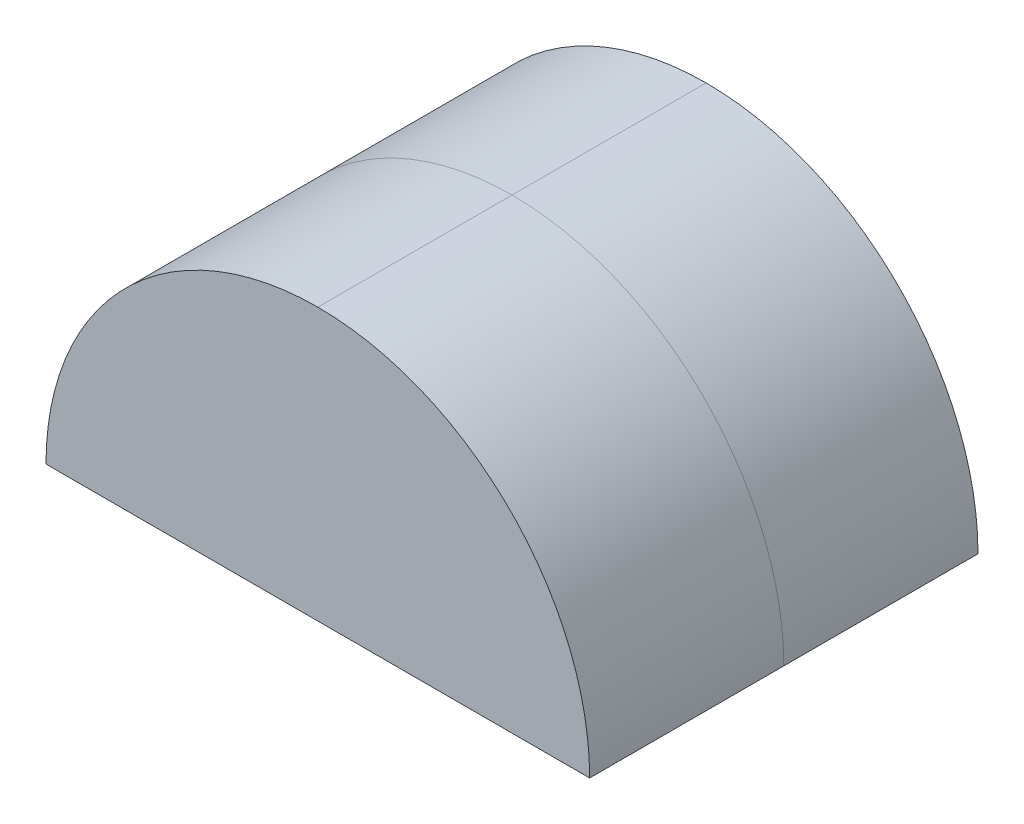
ISO-10303-21;
HEADER;
FILE_DESCRIPTION(('STEP AP214'),'2;1');
FILE_NAME('part.step','',(''),(''),'','','');
FILE_SCHEMA(('AUTOMOTIVE_DESIGN { 1 0 10303 214 1 1 1 1 }'));
ENDSEC;
DATA;
#1=APPLICATION_CONTEXT('core data for automotive mechanical design processes');
#2=APPLICATION_PROTOCOL_DEFINITION('international standard','automotive_design',2000,#1);
#3=PRODUCT_CONTEXT('',#1,'mechanical');
#4=PRODUCT('Part','Part','',(#3));
#5=PRODUCT_RELATED_PRODUCT_CATEGORY('part','',(#4));
#6=PRODUCT_DEFINITION_FORMATION('','',#4);
#7=PRODUCT_DEFINITION_CONTEXT('part definition',#1,'design');
#8=PRODUCT_DEFINITION('design','',#6,#7);
#9=PRODUCT_DEFINITION_SHAPE('','',#8);
#10=(LENGTH_UNIT() NAMED_UNIT(*) SI_UNIT(.MILLI.,.METRE.));
#11=(NAMED_UNIT(*) PLANE_ANGLE_UNIT() SI_UNIT($,.RADIAN.));
#12=(NAMED_UNIT(*) SI_UNIT($,.STERADIAN.) SOLID_ANGLE_UNIT());
#13=UNCERTAINTY_MEASURE_WITH_UNIT(LENGTH_MEASURE(1.E-05),#10,'distance_accuracy_value','');
#14=(GEOMETRIC_REPRESENTATION_CONTEXT(3) GLOBAL_UNCERTAINTY_ASSIGNED_CONTEXT((#13)) GLOBAL_UNIT_ASSIGNED_CONTEXT((#10,
#11,#12)) REPRESENTATION_CONTEXT('',''));
#15=CARTESIAN_POINT('',(0.,0.,0.));
#16=DIRECTION('',(0.,0.,1.));
#17=DIRECTION('',(1.,0.,0.));
#18=AXIS2_PLACEMENT_3D('',#15,#16,#17);
#19=CARTESIAN_POINT('',(0.,0.,25.4));
#20=DIRECTION('',(0.,0.,-1.));
#21=DIRECTION('',(-1.,0.,0.));
#22=AXIS2_PLACEMENT_3D('',#19,#20,#21);
#23=CYLINDRICAL_SURFACE('',#22,17.78);
#24=DIRECTION('',(0.,0.,-1.));
#25=VECTOR('',#24,1.);
#26=CARTESIAN_POINT('',(0.,17.78,25.4));
#27=LINE('',#26,#25);
#28=CARTESIAN_POINT('',(0.,17.78,12.7));
#29=VERTEX_POINT('',#28);
#30=CARTESIAN_POINT('',(0.,17.78,25.4));
#31=VERTEX_POINT('',#30);
#32=EDGE_CURVE('E88',#29,#31,#27,.F.);
#33=ORIENTED_EDGE('',*,*,#32,.F.);
#34=CARTESIAN_POINT('',(0.,0.,12.7));
#35=DIRECTION('',(0.,0.,-1.));
#36=DIRECTION('',(-1.,0.,0.));
#37=AXIS2_PLACEMENT_3D('',#34,#35,#36);
#38=CIRCLE('',#37,17.78);
#39=CARTESIAN_POINT('',(-17.78,0.,12.7));
#40=VERTEX_POINT('',#39);
#41=EDGE_CURVE('E11',#29,#40,#38,.F.);
#42=ORIENTED_EDGE('',*,*,#41,.T.);
#43=DIRECTION('',(0.,0.,-1.));
#44=VECTOR('',#43,1.);
#45=CARTESIAN_POINT('',(-17.78,0.,25.4));
#46=LINE('',#45,#44);
#47=CARTESIAN_POINT('',(-17.78,0.,25.4));
#48=VERTEX_POINT('',#47);
#49=EDGE_CURVE('E114',#48,#40,#46,.T.);
#50=ORIENTED_EDGE('',*,*,#49,.F.);
#51=CARTESIAN_POINT('',(0.,0.,25.4));
#52=DIRECTION('',(0.,0.,-1.));
#53=DIRECTION('',(-1.,0.,0.));
#54=AXIS2_PLACEMENT_3D('',#51,#52,#53);
#55=CIRCLE('',#54,17.78);
#56=EDGE_CURVE('E93',#48,#31,#55,.T.);
#57=ORIENTED_EDGE('',*,*,#56,.T.);
#58=EDGE_LOOP('',(#33,#42,#50,#57));
#59=FACE_BOUND('',#58,.T.);
#60=ADVANCED_FACE('F41',(#59),#23,.T.);
#61=DIRECTION('',(0.,0.,-1.));
#62=VECTOR('',#61,1.);
#63=CARTESIAN_POINT('',(17.78,0.,25.4));
#64=LINE('',#63,#62);
#65=CARTESIAN_POINT('',(17.78,0.,25.4));
#66=VERTEX_POINT('',#65);
#67=CARTESIAN_POINT('',(17.78,0.,12.7));
#68=VERTEX_POINT('',#67);
#69=EDGE_CURVE('E87',#66,#68,#64,.T.);
#70=ORIENTED_EDGE('',*,*,#69,.T.);
#71=CARTESIAN_POINT('',(0.,0.,12.7));
#72=DIRECTION('',(0.,0.,-1.));
#73=DIRECTION('',(-1.,0.,0.));
#74=AXIS2_PLACEMENT_3D('',#71,#72,#73);
#75=CIRCLE('',#74,17.78);
#76=EDGE_CURVE('E45',#68,#29,#75,.F.);
#77=ORIENTED_EDGE('',*,*,#76,.T.);
#78=ORIENTED_EDGE('',*,*,#32,.T.);
#79=EDGE_CURVE('E84',#31,#66,#55,.T.);
#80=ORIENTED_EDGE('',*,*,#79,.T.);
#81=EDGE_LOOP('',(#70,#77,#78,#80));
#82=FACE_BOUND('',#81,.T.);
#83=ADVANCED_FACE('F86',(#82),#23,.T.);
#84=ORIENTED_EDGE('',*,*,#76,.F.);
#85=CARTESIAN_POINT('',(17.78,0.,0.));
#86=VERTEX_POINT('',#85);
#87=EDGE_CURVE('E102',#68,#86,#64,.T.);
#88=ORIENTED_EDGE('',*,*,#87,.T.);
#89=CARTESIAN_POINT('',(0.,0.,0.));
#90=DIRECTION('',(0.,0.,-1.));
#91=DIRECTION('',(-1.,0.,0.));
#92=AXIS2_PLACEMENT_3D('',#89,#90,#91);
#93=CIRCLE('',#92,17.78);
#94=CARTESIAN_POINT('',(0.,17.78,0.));
#95=VERTEX_POINT('',#94);
#96=EDGE_CURVE('E111',#95,#86,#93,.T.);
#97=ORIENTED_EDGE('',*,*,#96,.F.);
#98=EDGE_CURVE('E116',#95,#29,#27,.F.);
#99=ORIENTED_EDGE('',*,*,#98,.T.);
#100=EDGE_LOOP('',(#84,#88,#97,#99));
#101=FACE_BOUND('',#100,.T.);
#102=ADVANCED_FACE('F134',(#101),#23,.T.);
#103=ORIENTED_EDGE('',*,*,#41,.F.);
#104=ORIENTED_EDGE('',*,*,#98,.F.);
#105=CARTESIAN_POINT('',(-17.78,0.,0.));
#106=VERTEX_POINT('',#105);
#107=EDGE_CURVE('E108',#106,#95,#93,.T.);
#108=ORIENTED_EDGE('',*,*,#107,.F.);
#109=EDGE_CURVE('E103',#40,#106,#46,.T.);
#110=ORIENTED_EDGE('',*,*,#109,.F.);
#111=EDGE_LOOP('',(#103,#104,#108,#110));
#112=FACE_BOUND('',#111,.T.);
#113=ADVANCED_FACE('F43',(#112),#23,.T.);
#114=CARTESIAN_POINT('',(17.78,0.,25.4));
#115=DIRECTION('',(0.,-1.,0.));
#116=DIRECTION('',(1.,0.,0.));
#117=AXIS2_PLACEMENT_3D('',#114,#115,#116);
#118=PLANE('',#117);
#119=DIRECTION('',(-1.,0.,0.));
#120=VECTOR('',#119,1.);
#121=CARTESIAN_POINT('',(17.78,0.,0.));
#122=LINE('',#121,#120);
#123=EDGE_CURVE('E94',#86,#106,#122,.T.);
#124=ORIENTED_EDGE('',*,*,#123,.F.);
#125=ORIENTED_EDGE('',*,*,#87,.F.);
#126=ORIENTED_EDGE('',*,*,#69,.F.);
#127=DIRECTION('',(-1.,0.,0.));
#128=VECTOR('',#127,1.);
#129=CARTESIAN_POINT('',(17.78,0.,25.4));
#130=LINE('',#129,#128);
#131=EDGE_CURVE('E101',#66,#48,#130,.T.);
#132=ORIENTED_EDGE('',*,*,#131,.T.);
#133=ORIENTED_EDGE('',*,*,#49,.T.);
#134=ORIENTED_EDGE('',*,*,#109,.T.);
#135=EDGE_LOOP('',(#124,#125,#126,#132,#133,#134));
#136=FACE_BOUND('',#135,.T.);
#137=ADVANCED_FACE('F99',(#136),#118,.T.);
#138=CARTESIAN_POINT('',(0.,0.,25.4));
#139=DIRECTION('',(0.,0.,-1.));
#140=DIRECTION('',(-1.,0.,0.));
#141=AXIS2_PLACEMENT_3D('',#138,#139,#140);
#142=PLANE('',#141);
#143=ORIENTED_EDGE('',*,*,#56,.F.);
#144=ORIENTED_EDGE('',*,*,#131,.F.);
#145=ORIENTED_EDGE('',*,*,#79,.F.);
#146=EDGE_LOOP('',(#143,#144,#145));
#147=FACE_BOUND('',#146,.T.);
#148=ADVANCED_FACE('F105',(#147),#142,.F.);
#149=CARTESIAN_POINT('',(0.,0.,0.));
#150=DIRECTION('',(0.,0.,-1.));
#151=DIRECTION('',(-1.,0.,0.));
#152=AXIS2_PLACEMENT_3D('',#149,#150,#151);
#153=PLANE('',#152);
#154=ORIENTED_EDGE('',*,*,#107,.T.);
#155=ORIENTED_EDGE('',*,*,#96,.T.);
#156=ORIENTED_EDGE('',*,*,#123,.T.);
#157=EDGE_LOOP('',(#154,#155,#156));
#158=FACE_BOUND('',#157,.T.);
#159=ADVANCED_FACE('F133',(#158),#153,.T.);
#160=CLOSED_SHELL('',(#60,#83,#102,#113,#137,#148,#159));
#161=MANIFOLD_SOLID_BREP('B2',#160);
#162=ADVANCED_BREP_SHAPE_REPRESENTATION('',(#18,#161),#14);
#163=SHAPE_DEFINITION_REPRESENTATION(#9,#162);
ENDSEC;
END-ISO-10303-21;
